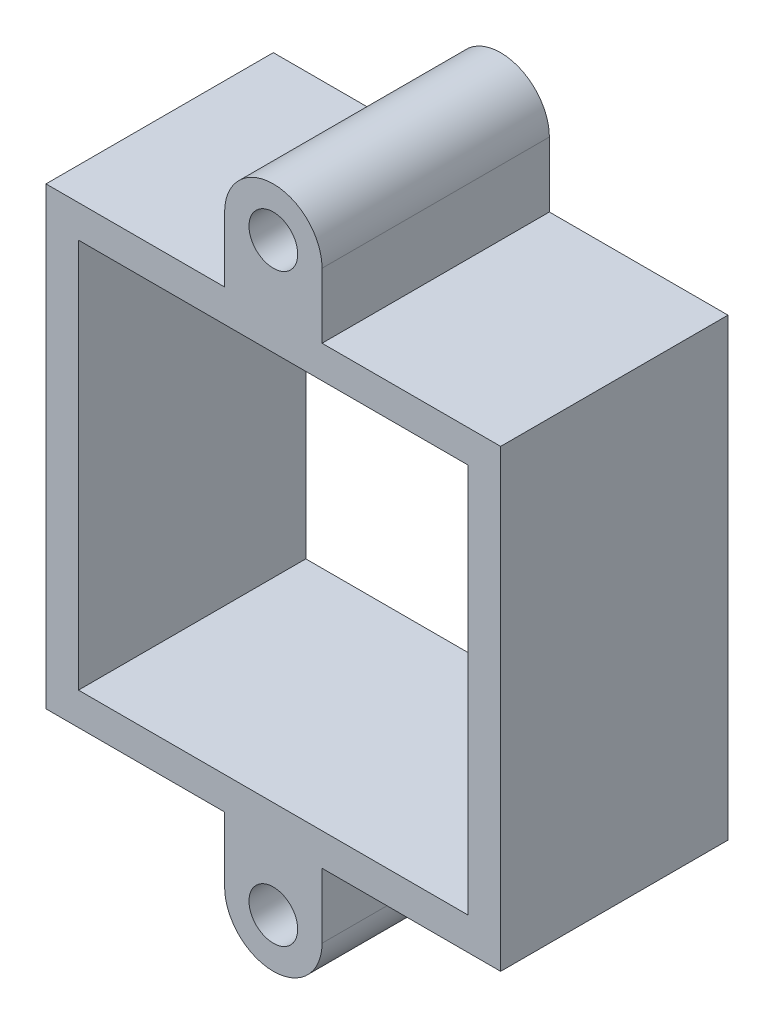
ISO-10303-21;
HEADER;
FILE_DESCRIPTION(('STEP AP214'),'2;1');
FILE_NAME('part.step','',(''),(''),'','','');
FILE_SCHEMA(('AUTOMOTIVE_DESIGN { 1 0 10303 214 1 1 1 1 }'));
ENDSEC;
DATA;
#1=APPLICATION_CONTEXT('core data for automotive mechanical design processes');
#2=APPLICATION_PROTOCOL_DEFINITION('international standard','automotive_design',2000,#1);
#3=PRODUCT_CONTEXT('',#1,'mechanical');
#4=PRODUCT('Part','Part','',(#3));
#5=PRODUCT_RELATED_PRODUCT_CATEGORY('part','',(#4));
#6=PRODUCT_DEFINITION_FORMATION('','',#4);
#7=PRODUCT_DEFINITION_CONTEXT('part definition',#1,'design');
#8=PRODUCT_DEFINITION('design','',#6,#7);
#9=PRODUCT_DEFINITION_SHAPE('','',#8);
#10=(LENGTH_UNIT() NAMED_UNIT(*) SI_UNIT(.MILLI.,.METRE.));
#11=(NAMED_UNIT(*) PLANE_ANGLE_UNIT() SI_UNIT($,.RADIAN.));
#12=(NAMED_UNIT(*) SI_UNIT($,.STERADIAN.) SOLID_ANGLE_UNIT());
#13=UNCERTAINTY_MEASURE_WITH_UNIT(LENGTH_MEASURE(1.E-05),#10,'distance_accuracy_value','');
#14=(GEOMETRIC_REPRESENTATION_CONTEXT(3) GLOBAL_UNCERTAINTY_ASSIGNED_CONTEXT((#13)) GLOBAL_UNIT_ASSIGNED_CONTEXT((#10,
#11,#12)) REPRESENTATION_CONTEXT('',''));
#15=CARTESIAN_POINT('',(0.,0.,0.));
#16=DIRECTION('',(0.,0.,1.));
#17=DIRECTION('',(1.,0.,0.));
#18=AXIS2_PLACEMENT_3D('',#15,#16,#17);
#19=CARTESIAN_POINT('',(-1.5,10.5,0.));
#20=DIRECTION('',(-1.,0.,0.));
#21=DIRECTION('',(0.,0.,1.));
#22=AXIS2_PLACEMENT_3D('',#19,#20,#21);
#23=PLANE('',#22);
#24=DIRECTION('',(0.,-1.,0.));
#25=VECTOR('',#24,1.);
#26=CARTESIAN_POINT('',(-1.5,10.5,7.));
#27=LINE('',#26,#25);
#28=CARTESIAN_POINT('',(-1.5,9.,7.));
#29=VERTEX_POINT('',#28);
#30=CARTESIAN_POINT('',(-1.5,7.,7.));
#31=VERTEX_POINT('',#30);
#32=EDGE_CURVE('E212',#29,#31,#27,.T.);
#33=ORIENTED_EDGE('',*,*,#32,.F.);
#34=DIRECTION('',(0.,0.,1.));
#35=VECTOR('',#34,1.);
#36=CARTESIAN_POINT('',(-1.5,9.,0.));
#37=LINE('',#36,#35);
#38=CARTESIAN_POINT('',(-1.5,9.,0.));
#39=VERTEX_POINT('',#38);
#40=EDGE_CURVE('E193',#39,#29,#37,.T.);
#41=ORIENTED_EDGE('',*,*,#40,.F.);
#42=DIRECTION('',(0.,-1.,0.));
#43=VECTOR('',#42,1.);
#44=CARTESIAN_POINT('',(-1.5,10.5,0.));
#45=LINE('',#44,#43);
#46=CARTESIAN_POINT('',(-1.5,7.,0.));
#47=VERTEX_POINT('',#46);
#48=EDGE_CURVE('E85',#39,#47,#45,.T.);
#49=ORIENTED_EDGE('',*,*,#48,.T.);
#50=DIRECTION('',(0.,0.,-1.));
#51=VECTOR('',#50,1.);
#52=CARTESIAN_POINT('',(-1.5,7.,0.));
#53=LINE('',#52,#51);
#54=EDGE_CURVE('E339',#31,#47,#53,.T.);
#55=ORIENTED_EDGE('',*,*,#54,.F.);
#56=EDGE_LOOP('',(#33,#41,#49,#55));
#57=FACE_BOUND('',#56,.T.);
#58=ADVANCED_FACE('F70',(#57),#23,.T.);
#59=CARTESIAN_POINT('',(-7.,7.,7.));
#60=DIRECTION('',(0.,-1.,0.));
#61=DIRECTION('',(1.,0.,0.));
#62=AXIS2_PLACEMENT_3D('',#59,#60,#61);
#63=PLANE('',#62);
#64=DIRECTION('',(-1.,0.,0.));
#65=VECTOR('',#64,1.);
#66=CARTESIAN_POINT('',(-7.,7.,0.));
#67=LINE('',#66,#65);
#68=CARTESIAN_POINT('',(7.,7.,0.));
#69=VERTEX_POINT('',#68);
#70=CARTESIAN_POINT('',(1.5,7.,0.));
#71=VERTEX_POINT('',#70);
#72=EDGE_CURVE('E277',#69,#71,#67,.T.);
#73=ORIENTED_EDGE('',*,*,#72,.T.);
#74=DIRECTION('',(0.,0.,1.));
#75=VECTOR('',#74,1.);
#76=CARTESIAN_POINT('',(1.5,7.,0.));
#77=LINE('',#76,#75);
#78=CARTESIAN_POINT('',(1.5,7.,7.));
#79=VERTEX_POINT('',#78);
#80=EDGE_CURVE('E205',#71,#79,#77,.T.);
#81=ORIENTED_EDGE('',*,*,#80,.T.);
#82=DIRECTION('',(-1.,0.,0.));
#83=VECTOR('',#82,1.);
#84=CARTESIAN_POINT('',(-7.,7.,7.));
#85=LINE('',#84,#83);
#86=CARTESIAN_POINT('',(7.,7.,7.));
#87=VERTEX_POINT('',#86);
#88=EDGE_CURVE('E284',#87,#79,#85,.T.);
#89=ORIENTED_EDGE('',*,*,#88,.F.);
#90=DIRECTION('',(0.,0.,-1.));
#91=VECTOR('',#90,1.);
#92=CARTESIAN_POINT('',(7.,7.,7.));
#93=LINE('',#92,#91);
#94=EDGE_CURVE('E300',#87,#69,#93,.T.);
#95=ORIENTED_EDGE('',*,*,#94,.T.);
#96=EDGE_LOOP('',(#73,#81,#89,#95));
#97=FACE_BOUND('',#96,.T.);
#98=ADVANCED_FACE('F313',(#97),#63,.F.);
#99=CARTESIAN_POINT('',(0.,0.,7.));
#100=DIRECTION('',(0.,0.,-1.));
#101=DIRECTION('',(-1.,0.,0.));
#102=AXIS2_PLACEMENT_3D('',#99,#100,#101);
#103=PLANE('',#102);
#104=CARTESIAN_POINT('',(0.,9.,7.));
#105=DIRECTION('',(0.,0.,-1.));
#106=DIRECTION('',(1.,0.,0.));
#107=AXIS2_PLACEMENT_3D('',#104,#105,#106);
#108=CIRCLE('',#107,0.750000000000001);
#109=CARTESIAN_POINT('',(0.750000000000001,9.,7.));
#110=VERTEX_POINT('',#109);
#111=EDGE_CURVE('E346',#110,#110,#108,.T.);
#112=ORIENTED_EDGE('',*,*,#111,.T.);
#113=EDGE_LOOP('',(#112));
#114=FACE_BOUND('',#113,.T.);
#115=CARTESIAN_POINT('',(0.,-9.,7.));
#116=DIRECTION('',(0.,0.,1.));
#117=DIRECTION('',(1.,0.,0.));
#118=AXIS2_PLACEMENT_3D('',#115,#116,#117);
#119=CIRCLE('',#118,0.750000000000001);
#120=CARTESIAN_POINT('',(0.750000000000001,-9.,7.));
#121=VERTEX_POINT('',#120);
#122=EDGE_CURVE('E222',#121,#121,#119,.T.);
#123=ORIENTED_EDGE('',*,*,#122,.F.);
#124=EDGE_LOOP('',(#123));
#125=FACE_BOUND('',#124,.T.);
#126=DIRECTION('',(0.,1.,0.));
#127=VECTOR('',#126,1.);
#128=CARTESIAN_POINT('',(6.,-6.,7.));
#129=LINE('',#128,#127);
#130=CARTESIAN_POINT('',(6.,-6.,7.));
#131=VERTEX_POINT('',#130);
#132=CARTESIAN_POINT('',(6.,6.,7.));
#133=VERTEX_POINT('',#132);
#134=EDGE_CURVE('E242',#131,#133,#129,.T.);
#135=ORIENTED_EDGE('',*,*,#134,.F.);
#136=DIRECTION('',(1.,0.,0.));
#137=VECTOR('',#136,1.);
#138=CARTESIAN_POINT('',(-6.,-6.,7.));
#139=LINE('',#138,#137);
#140=CARTESIAN_POINT('',(-6.,-6.,7.));
#141=VERTEX_POINT('',#140);
#142=EDGE_CURVE('E250',#141,#131,#139,.T.);
#143=ORIENTED_EDGE('',*,*,#142,.F.);
#144=DIRECTION('',(0.,-1.,0.));
#145=VECTOR('',#144,1.);
#146=CARTESIAN_POINT('',(-6.,-6.,7.));
#147=LINE('',#146,#145);
#148=CARTESIAN_POINT('',(-6.,6.,7.));
#149=VERTEX_POINT('',#148);
#150=EDGE_CURVE('E247',#149,#141,#147,.T.);
#151=ORIENTED_EDGE('',*,*,#150,.F.);
#152=DIRECTION('',(-1.,0.,0.));
#153=VECTOR('',#152,1.);
#154=CARTESIAN_POINT('',(-6.,6.,7.));
#155=LINE('',#154,#153);
#156=EDGE_CURVE('E244',#133,#149,#155,.T.);
#157=ORIENTED_EDGE('',*,*,#156,.F.);
#158=EDGE_LOOP('',(#135,#143,#151,#157));
#159=FACE_BOUND('',#158,.T.);
#160=DIRECTION('',(0.,-1.,0.));
#161=VECTOR('',#160,1.);
#162=CARTESIAN_POINT('',(1.5,10.5,7.));
#163=LINE('',#162,#161);
#164=CARTESIAN_POINT('',(1.5,9.,7.));
#165=VERTEX_POINT('',#164);
#166=EDGE_CURVE('E316',#165,#79,#163,.T.);
#167=ORIENTED_EDGE('',*,*,#166,.F.);
#168=CARTESIAN_POINT('',(0.,9.,7.));
#169=DIRECTION('',(0.,0.,-1.));
#170=DIRECTION('',(1.,0.,0.));
#171=AXIS2_PLACEMENT_3D('',#168,#169,#170);
#172=CIRCLE('',#171,1.5);
#173=EDGE_CURVE('E194',#29,#165,#172,.T.);
#174=ORIENTED_EDGE('',*,*,#173,.F.);
#175=ORIENTED_EDGE('',*,*,#32,.T.);
#176=CARTESIAN_POINT('',(-7.,7.,7.));
#177=VERTEX_POINT('',#176);
#178=EDGE_CURVE('E283',#31,#177,#85,.T.);
#179=ORIENTED_EDGE('',*,*,#178,.T.);
#180=DIRECTION('',(0.,-1.,0.));
#181=VECTOR('',#180,1.);
#182=CARTESIAN_POINT('',(-7.,-7.,7.));
#183=LINE('',#182,#181);
#184=CARTESIAN_POINT('',(-7.,-7.,7.));
#185=VERTEX_POINT('',#184);
#186=EDGE_CURVE('E273',#177,#185,#183,.T.);
#187=ORIENTED_EDGE('',*,*,#186,.T.);
#188=DIRECTION('',(1.,0.,0.));
#189=VECTOR('',#188,1.);
#190=CARTESIAN_POINT('',(-7.,-7.,7.));
#191=LINE('',#190,#189);
#192=CARTESIAN_POINT('',(-1.5,-7.,7.));
#193=VERTEX_POINT('',#192);
#194=EDGE_CURVE('E278',#185,#193,#191,.T.);
#195=ORIENTED_EDGE('',*,*,#194,.T.);
#196=DIRECTION('',(0.,1.,0.));
#197=VECTOR('',#196,1.);
#198=CARTESIAN_POINT('',(-1.5,-10.5,7.));
#199=LINE('',#198,#197);
#200=CARTESIAN_POINT('',(-1.5,-9.,7.));
#201=VERTEX_POINT('',#200);
#202=EDGE_CURVE('E238',#201,#193,#199,.T.);
#203=ORIENTED_EDGE('',*,*,#202,.F.);
#204=CARTESIAN_POINT('',(0.,-9.,7.));
#205=DIRECTION('',(0.,0.,1.));
#206=DIRECTION('',(1.,0.,0.));
#207=AXIS2_PLACEMENT_3D('',#204,#205,#206);
#208=CIRCLE('',#207,1.5);
#209=CARTESIAN_POINT('',(1.5,-9.,7.));
#210=VERTEX_POINT('',#209);
#211=EDGE_CURVE('E210',#201,#210,#208,.T.);
#212=ORIENTED_EDGE('',*,*,#211,.T.);
#213=DIRECTION('',(0.,1.,0.));
#214=VECTOR('',#213,1.);
#215=CARTESIAN_POINT('',(1.5,-10.5,7.));
#216=LINE('',#215,#214);
#217=CARTESIAN_POINT('',(1.5,-7.,7.));
#218=VERTEX_POINT('',#217);
#219=EDGE_CURVE('E93',#210,#218,#216,.T.);
#220=ORIENTED_EDGE('',*,*,#219,.T.);
#221=CARTESIAN_POINT('',(7.,-7.,7.));
#222=VERTEX_POINT('',#221);
#223=EDGE_CURVE('E276',#218,#222,#191,.T.);
#224=ORIENTED_EDGE('',*,*,#223,.T.);
#225=DIRECTION('',(0.,1.,0.));
#226=VECTOR('',#225,1.);
#227=CARTESIAN_POINT('',(7.,-7.,7.));
#228=LINE('',#227,#226);
#229=EDGE_CURVE('E281',#222,#87,#228,.T.);
#230=ORIENTED_EDGE('',*,*,#229,.T.);
#231=ORIENTED_EDGE('',*,*,#88,.T.);
#232=EDGE_LOOP('',(#167,#174,#175,#179,#187,#195,#203,#212,#220,#224,#230,#231));
#233=FACE_BOUND('',#232,.T.);
#234=ADVANCED_FACE('F315',(#114,#125,#159,#233),#103,.F.);
#235=CARTESIAN_POINT('',(0.,0.,0.));
#236=DIRECTION('',(0.,0.,-1.));
#237=DIRECTION('',(-1.,0.,0.));
#238=AXIS2_PLACEMENT_3D('',#235,#236,#237);
#239=PLANE('',#238);
#240=CARTESIAN_POINT('',(0.,9.,0.));
#241=DIRECTION('',(0.,0.,-1.));
#242=DIRECTION('',(1.,0.,0.));
#243=AXIS2_PLACEMENT_3D('',#240,#241,#242);
#244=CIRCLE('',#243,1.5);
#245=CARTESIAN_POINT('',(1.5,9.,0.));
#246=VERTEX_POINT('',#245);
#247=EDGE_CURVE('E183',#39,#246,#244,.T.);
#248=ORIENTED_EDGE('',*,*,#247,.T.);
#249=DIRECTION('',(0.,-1.,0.));
#250=VECTOR('',#249,1.);
#251=CARTESIAN_POINT('',(1.5,10.5,0.));
#252=LINE('',#251,#250);
#253=EDGE_CURVE('E189',#246,#71,#252,.T.);
#254=ORIENTED_EDGE('',*,*,#253,.T.);
#255=ORIENTED_EDGE('',*,*,#72,.F.);
#256=DIRECTION('',(0.,1.,0.));
#257=VECTOR('',#256,1.);
#258=CARTESIAN_POINT('',(7.,-7.,0.));
#259=LINE('',#258,#257);
#260=CARTESIAN_POINT('',(7.,-7.,0.));
#261=VERTEX_POINT('',#260);
#262=EDGE_CURVE('E294',#261,#69,#259,.T.);
#263=ORIENTED_EDGE('',*,*,#262,.F.);
#264=DIRECTION('',(1.,0.,0.));
#265=VECTOR('',#264,1.);
#266=CARTESIAN_POINT('',(-7.,-7.,0.));
#267=LINE('',#266,#265);
#268=CARTESIAN_POINT('',(1.5,-7.,0.));
#269=VERTEX_POINT('',#268);
#270=EDGE_CURVE('E290',#269,#261,#267,.T.);
#271=ORIENTED_EDGE('',*,*,#270,.F.);
#272=DIRECTION('',(0.,1.,0.));
#273=VECTOR('',#272,1.);
#274=CARTESIAN_POINT('',(1.5,-10.5,0.));
#275=LINE('',#274,#273);
#276=CARTESIAN_POINT('',(1.5,-9.,0.));
#277=VERTEX_POINT('',#276);
#278=EDGE_CURVE('E234',#277,#269,#275,.T.);
#279=ORIENTED_EDGE('',*,*,#278,.F.);
#280=CARTESIAN_POINT('',(0.,-9.,0.));
#281=DIRECTION('',(0.,0.,1.));
#282=DIRECTION('',(1.,0.,0.));
#283=AXIS2_PLACEMENT_3D('',#280,#281,#282);
#284=CIRCLE('',#283,1.5);
#285=CARTESIAN_POINT('',(-1.5,-9.,0.));
#286=VERTEX_POINT('',#285);
#287=EDGE_CURVE('E216',#286,#277,#284,.T.);
#288=ORIENTED_EDGE('',*,*,#287,.F.);
#289=DIRECTION('',(0.,1.,0.));
#290=VECTOR('',#289,1.);
#291=CARTESIAN_POINT('',(-1.5,-10.5,0.));
#292=LINE('',#291,#290);
#293=CARTESIAN_POINT('',(-1.5,-7.,0.));
#294=VERTEX_POINT('',#293);
#295=EDGE_CURVE('E236',#286,#294,#292,.T.);
#296=ORIENTED_EDGE('',*,*,#295,.T.);
#297=CARTESIAN_POINT('',(-7.,-7.,0.));
#298=VERTEX_POINT('',#297);
#299=EDGE_CURVE('E291',#298,#294,#267,.T.);
#300=ORIENTED_EDGE('',*,*,#299,.F.);
#301=DIRECTION('',(0.,-1.,0.));
#302=VECTOR('',#301,1.);
#303=CARTESIAN_POINT('',(-7.,-7.,0.));
#304=LINE('',#303,#302);
#305=CARTESIAN_POINT('',(-7.,7.,0.));
#306=VERTEX_POINT('',#305);
#307=EDGE_CURVE('E272',#306,#298,#304,.T.);
#308=ORIENTED_EDGE('',*,*,#307,.F.);
#309=EDGE_CURVE('E296',#47,#306,#67,.T.);
#310=ORIENTED_EDGE('',*,*,#309,.F.);
#311=ORIENTED_EDGE('',*,*,#48,.F.);
#312=EDGE_LOOP('',(#248,#254,#255,#263,#271,#279,#288,#296,#300,#308,#310,#311));
#313=FACE_BOUND('',#312,.T.);
#314=CARTESIAN_POINT('',(0.,9.,0.));
#315=DIRECTION('',(0.,0.,-1.));
#316=DIRECTION('',(1.,0.,0.));
#317=AXIS2_PLACEMENT_3D('',#314,#315,#316);
#318=CIRCLE('',#317,0.750000000000001);
#319=CARTESIAN_POINT('',(0.750000000000001,9.,0.));
#320=VERTEX_POINT('',#319);
#321=EDGE_CURVE('E343',#320,#320,#318,.T.);
#322=ORIENTED_EDGE('',*,*,#321,.F.);
#323=EDGE_LOOP('',(#322));
#324=FACE_BOUND('',#323,.T.);
#325=CARTESIAN_POINT('',(0.,-9.,0.));
#326=DIRECTION('',(0.,0.,1.));
#327=DIRECTION('',(1.,0.,0.));
#328=AXIS2_PLACEMENT_3D('',#325,#326,#327);
#329=CIRCLE('',#328,0.750000000000001);
#330=CARTESIAN_POINT('',(0.750000000000001,-9.,0.));
#331=VERTEX_POINT('',#330);
#332=EDGE_CURVE('E223',#331,#331,#329,.T.);
#333=ORIENTED_EDGE('',*,*,#332,.T.);
#334=EDGE_LOOP('',(#333));
#335=FACE_BOUND('',#334,.T.);
#336=DIRECTION('',(1.,0.,0.));
#337=VECTOR('',#336,1.);
#338=CARTESIAN_POINT('',(-6.,-6.,0.));
#339=LINE('',#338,#337);
#340=CARTESIAN_POINT('',(-6.,-6.,0.));
#341=VERTEX_POINT('',#340);
#342=CARTESIAN_POINT('',(6.,-6.,0.));
#343=VERTEX_POINT('',#342);
#344=EDGE_CURVE('E245',#341,#343,#339,.T.);
#345=ORIENTED_EDGE('',*,*,#344,.T.);
#346=DIRECTION('',(0.,1.,0.));
#347=VECTOR('',#346,1.);
#348=CARTESIAN_POINT('',(6.,-6.,0.));
#349=LINE('',#348,#347);
#350=CARTESIAN_POINT('',(6.,6.,0.));
#351=VERTEX_POINT('',#350);
#352=EDGE_CURVE('E241',#343,#351,#349,.T.);
#353=ORIENTED_EDGE('',*,*,#352,.T.);
#354=DIRECTION('',(-1.,0.,0.));
#355=VECTOR('',#354,1.);
#356=CARTESIAN_POINT('',(-6.,6.,0.));
#357=LINE('',#356,#355);
#358=CARTESIAN_POINT('',(-6.,6.,0.));
#359=VERTEX_POINT('',#358);
#360=EDGE_CURVE('E255',#351,#359,#357,.T.);
#361=ORIENTED_EDGE('',*,*,#360,.T.);
#362=DIRECTION('',(0.,-1.,0.));
#363=VECTOR('',#362,1.);
#364=CARTESIAN_POINT('',(-6.,-6.,0.));
#365=LINE('',#364,#363);
#366=EDGE_CURVE('E258',#359,#341,#365,.T.);
#367=ORIENTED_EDGE('',*,*,#366,.T.);
#368=EDGE_LOOP('',(#345,#353,#361,#367));
#369=FACE_BOUND('',#368,.T.);
#370=ADVANCED_FACE('F185',(#313,#324,#335,#369),#239,.T.);
#371=CARTESIAN_POINT('',(1.5,-10.5,0.));
#372=DIRECTION('',(-1.,0.,0.));
#373=DIRECTION('',(0.,0.,1.));
#374=AXIS2_PLACEMENT_3D('',#371,#372,#373);
#375=PLANE('',#374);
#376=DIRECTION('',(0.,0.,1.));
#377=VECTOR('',#376,1.);
#378=CARTESIAN_POINT('',(1.5,-9.,0.));
#379=LINE('',#378,#377);
#380=EDGE_CURVE('E207',#277,#210,#379,.T.);
#381=ORIENTED_EDGE('',*,*,#380,.F.);
#382=ORIENTED_EDGE('',*,*,#278,.T.);
#383=DIRECTION('',(0.,0.,1.));
#384=VECTOR('',#383,1.);
#385=CARTESIAN_POINT('',(1.5,-7.,0.));
#386=LINE('',#385,#384);
#387=EDGE_CURVE('E226',#269,#218,#386,.T.);
#388=ORIENTED_EDGE('',*,*,#387,.T.);
#389=ORIENTED_EDGE('',*,*,#219,.F.);
#390=EDGE_LOOP('',(#381,#382,#388,#389));
#391=FACE_BOUND('',#390,.T.);
#392=ADVANCED_FACE('F321',(#391),#375,.F.);
#393=CARTESIAN_POINT('',(-7.,-7.,7.));
#394=DIRECTION('',(0.,1.,0.));
#395=DIRECTION('',(0.,0.,1.));
#396=AXIS2_PLACEMENT_3D('',#393,#394,#395);
#397=PLANE('',#396);
#398=ORIENTED_EDGE('',*,*,#387,.F.);
#399=ORIENTED_EDGE('',*,*,#270,.T.);
#400=DIRECTION('',(0.,0.,-1.));
#401=VECTOR('',#400,1.);
#402=CARTESIAN_POINT('',(7.,-7.,7.));
#403=LINE('',#402,#401);
#404=EDGE_CURVE('E78',#222,#261,#403,.T.);
#405=ORIENTED_EDGE('',*,*,#404,.F.);
#406=ORIENTED_EDGE('',*,*,#223,.F.);
#407=EDGE_LOOP('',(#398,#399,#405,#406));
#408=FACE_BOUND('',#407,.T.);
#409=ADVANCED_FACE('F318',(#408),#397,.F.);
#410=DIRECTION('',(0.,0.,-1.));
#411=VECTOR('',#410,1.);
#412=CARTESIAN_POINT('',(-1.5,-7.,0.));
#413=LINE('',#412,#411);
#414=EDGE_CURVE('E231',#193,#294,#413,.T.);
#415=ORIENTED_EDGE('',*,*,#414,.F.);
#416=ORIENTED_EDGE('',*,*,#194,.F.);
#417=DIRECTION('',(0.,0.,-1.));
#418=VECTOR('',#417,1.);
#419=CARTESIAN_POINT('',(-7.,-7.,7.));
#420=LINE('',#419,#418);
#421=EDGE_CURVE('E12',#185,#298,#420,.T.);
#422=ORIENTED_EDGE('',*,*,#421,.T.);
#423=ORIENTED_EDGE('',*,*,#299,.T.);
#424=EDGE_LOOP('',(#415,#416,#422,#423));
#425=FACE_BOUND('',#424,.T.);
#426=ADVANCED_FACE('F330',(#425),#397,.F.);
#427=CARTESIAN_POINT('',(-7.,-7.,7.));
#428=DIRECTION('',(1.,0.,0.));
#429=DIRECTION('',(0.,0.,-1.));
#430=AXIS2_PLACEMENT_3D('',#427,#428,#429);
#431=PLANE('',#430);
#432=ORIENTED_EDGE('',*,*,#307,.T.);
#433=ORIENTED_EDGE('',*,*,#421,.F.);
#434=ORIENTED_EDGE('',*,*,#186,.F.);
#435=DIRECTION('',(0.,0.,-1.));
#436=VECTOR('',#435,1.);
#437=CARTESIAN_POINT('',(-7.,7.,7.));
#438=LINE('',#437,#436);
#439=EDGE_CURVE('E287',#177,#306,#438,.T.);
#440=ORIENTED_EDGE('',*,*,#439,.T.);
#441=EDGE_LOOP('',(#432,#433,#434,#440));
#442=FACE_BOUND('',#441,.T.);
#443=ADVANCED_FACE('F72',(#442),#431,.F.);
#444=CARTESIAN_POINT('',(7.,-7.,7.));
#445=DIRECTION('',(-1.,0.,0.));
#446=DIRECTION('',(0.,-1.,0.));
#447=AXIS2_PLACEMENT_3D('',#444,#445,#446);
#448=PLANE('',#447);
#449=ORIENTED_EDGE('',*,*,#262,.T.);
#450=ORIENTED_EDGE('',*,*,#94,.F.);
#451=ORIENTED_EDGE('',*,*,#229,.F.);
#452=ORIENTED_EDGE('',*,*,#404,.T.);
#453=EDGE_LOOP('',(#449,#450,#451,#452));
#454=FACE_BOUND('',#453,.T.);
#455=ADVANCED_FACE('F307',(#454),#448,.F.);
#456=ORIENTED_EDGE('',*,*,#178,.F.);
#457=ORIENTED_EDGE('',*,*,#54,.T.);
#458=ORIENTED_EDGE('',*,*,#309,.T.);
#459=ORIENTED_EDGE('',*,*,#439,.F.);
#460=EDGE_LOOP('',(#456,#457,#458,#459));
#461=FACE_BOUND('',#460,.T.);
#462=ADVANCED_FACE('F338',(#461),#63,.F.);
#463=CARTESIAN_POINT('',(6.,-6.,7.));
#464=DIRECTION('',(-1.,0.,0.));
#465=DIRECTION('',(0.,0.,1.));
#466=AXIS2_PLACEMENT_3D('',#463,#464,#465);
#467=PLANE('',#466);
#468=ORIENTED_EDGE('',*,*,#352,.F.);
#469=DIRECTION('',(0.,0.,-1.));
#470=VECTOR('',#469,1.);
#471=CARTESIAN_POINT('',(6.,-6.,7.));
#472=LINE('',#471,#470);
#473=EDGE_CURVE('E252',#131,#343,#472,.T.);
#474=ORIENTED_EDGE('',*,*,#473,.F.);
#475=ORIENTED_EDGE('',*,*,#134,.T.);
#476=DIRECTION('',(0.,0.,-1.));
#477=VECTOR('',#476,1.);
#478=CARTESIAN_POINT('',(6.,6.,7.));
#479=LINE('',#478,#477);
#480=EDGE_CURVE('E269',#133,#351,#479,.T.);
#481=ORIENTED_EDGE('',*,*,#480,.T.);
#482=EDGE_LOOP('',(#468,#474,#475,#481));
#483=FACE_BOUND('',#482,.T.);
#484=ADVANCED_FACE('F369',(#483),#467,.T.);
#485=CARTESIAN_POINT('',(-6.,6.,7.));
#486=DIRECTION('',(0.,-1.,0.));
#487=DIRECTION('',(0.,0.,-1.));
#488=AXIS2_PLACEMENT_3D('',#485,#486,#487);
#489=PLANE('',#488);
#490=ORIENTED_EDGE('',*,*,#360,.F.);
#491=ORIENTED_EDGE('',*,*,#480,.F.);
#492=ORIENTED_EDGE('',*,*,#156,.T.);
#493=DIRECTION('',(0.,0.,-1.));
#494=VECTOR('',#493,1.);
#495=CARTESIAN_POINT('',(-6.,6.,7.));
#496=LINE('',#495,#494);
#497=EDGE_CURVE('E267',#149,#359,#496,.T.);
#498=ORIENTED_EDGE('',*,*,#497,.T.);
#499=EDGE_LOOP('',(#490,#491,#492,#498));
#500=FACE_BOUND('',#499,.T.);
#501=ADVANCED_FACE('F376',(#500),#489,.T.);
#502=CARTESIAN_POINT('',(-6.,-6.,7.));
#503=DIRECTION('',(1.,0.,0.));
#504=DIRECTION('',(0.,0.,-1.));
#505=AXIS2_PLACEMENT_3D('',#502,#503,#504);
#506=PLANE('',#505);
#507=ORIENTED_EDGE('',*,*,#366,.F.);
#508=ORIENTED_EDGE('',*,*,#497,.F.);
#509=ORIENTED_EDGE('',*,*,#150,.T.);
#510=DIRECTION('',(0.,0.,-1.));
#511=VECTOR('',#510,1.);
#512=CARTESIAN_POINT('',(-6.,-6.,7.));
#513=LINE('',#512,#511);
#514=EDGE_CURVE('E265',#141,#341,#513,.T.);
#515=ORIENTED_EDGE('',*,*,#514,.T.);
#516=EDGE_LOOP('',(#507,#508,#509,#515));
#517=FACE_BOUND('',#516,.T.);
#518=ADVANCED_FACE('F378',(#517),#506,.T.);
#519=CARTESIAN_POINT('',(-6.,-6.,7.));
#520=DIRECTION('',(0.,1.,0.));
#521=DIRECTION('',(0.,0.,1.));
#522=AXIS2_PLACEMENT_3D('',#519,#520,#521);
#523=PLANE('',#522);
#524=ORIENTED_EDGE('',*,*,#344,.F.);
#525=ORIENTED_EDGE('',*,*,#514,.F.);
#526=ORIENTED_EDGE('',*,*,#142,.T.);
#527=ORIENTED_EDGE('',*,*,#473,.T.);
#528=EDGE_LOOP('',(#524,#525,#526,#527));
#529=FACE_BOUND('',#528,.T.);
#530=ADVANCED_FACE('F364',(#529),#523,.T.);
#531=CARTESIAN_POINT('',(-1.5,-10.5,0.));
#532=DIRECTION('',(1.,0.,0.));
#533=DIRECTION('',(0.,0.,-1.));
#534=AXIS2_PLACEMENT_3D('',#531,#532,#533);
#535=PLANE('',#534);
#536=ORIENTED_EDGE('',*,*,#295,.F.);
#537=DIRECTION('',(0.,0.,1.));
#538=VECTOR('',#537,1.);
#539=CARTESIAN_POINT('',(-1.5,-9.,0.));
#540=LINE('',#539,#538);
#541=EDGE_CURVE('E218',#286,#201,#540,.T.);
#542=ORIENTED_EDGE('',*,*,#541,.T.);
#543=ORIENTED_EDGE('',*,*,#202,.T.);
#544=ORIENTED_EDGE('',*,*,#414,.T.);
#545=EDGE_LOOP('',(#536,#542,#543,#544));
#546=FACE_BOUND('',#545,.T.);
#547=ADVANCED_FACE('F326',(#546),#535,.F.);
#548=CARTESIAN_POINT('',(0.,-9.,0.));
#549=DIRECTION('',(0.,0.,1.));
#550=DIRECTION('',(1.,0.,0.));
#551=AXIS2_PLACEMENT_3D('',#548,#549,#550);
#552=CYLINDRICAL_SURFACE('',#551,0.750000000000001);
#553=ORIENTED_EDGE('',*,*,#332,.F.);
#554=EDGE_LOOP('',(#553));
#555=FACE_BOUND('',#554,.T.);
#556=ORIENTED_EDGE('',*,*,#122,.T.);
#557=EDGE_LOOP('',(#556));
#558=FACE_BOUND('',#557,.T.);
#559=ADVANCED_FACE('F401',(#555,#558),#552,.F.);
#560=CARTESIAN_POINT('',(0.,-9.,0.));
#561=DIRECTION('',(0.,0.,1.));
#562=DIRECTION('',(1.,0.,0.));
#563=AXIS2_PLACEMENT_3D('',#560,#561,#562);
#564=CYLINDRICAL_SURFACE('',#563,1.5);
#565=ORIENTED_EDGE('',*,*,#211,.F.);
#566=ORIENTED_EDGE('',*,*,#541,.F.);
#567=ORIENTED_EDGE('',*,*,#287,.T.);
#568=ORIENTED_EDGE('',*,*,#380,.T.);
#569=EDGE_LOOP('',(#565,#566,#567,#568));
#570=FACE_BOUND('',#569,.T.);
#571=ADVANCED_FACE('F398',(#570),#564,.T.);
#572=CARTESIAN_POINT('',(1.5,10.5,0.));
#573=DIRECTION('',(1.,0.,0.));
#574=DIRECTION('',(0.,0.,-1.));
#575=AXIS2_PLACEMENT_3D('',#572,#573,#574);
#576=PLANE('',#575);
#577=DIRECTION('',(0.,0.,1.));
#578=VECTOR('',#577,1.);
#579=CARTESIAN_POINT('',(1.5,9.,0.));
#580=LINE('',#579,#578);
#581=EDGE_CURVE('E197',#246,#165,#580,.T.);
#582=ORIENTED_EDGE('',*,*,#581,.T.);
#583=ORIENTED_EDGE('',*,*,#166,.T.);
#584=ORIENTED_EDGE('',*,*,#80,.F.);
#585=ORIENTED_EDGE('',*,*,#253,.F.);
#586=EDGE_LOOP('',(#582,#583,#584,#585));
#587=FACE_BOUND('',#586,.T.);
#588=ADVANCED_FACE('F203',(#587),#576,.T.);
#589=CARTESIAN_POINT('',(0.,9.,0.));
#590=DIRECTION('',(0.,0.,1.));
#591=DIRECTION('',(1.,0.,0.));
#592=AXIS2_PLACEMENT_3D('',#589,#590,#591);
#593=CYLINDRICAL_SURFACE('',#592,0.750000000000001);
#594=ORIENTED_EDGE('',*,*,#321,.T.);
#595=EDGE_LOOP('',(#594));
#596=FACE_BOUND('',#595,.T.);
#597=ORIENTED_EDGE('',*,*,#111,.F.);
#598=EDGE_LOOP('',(#597));
#599=FACE_BOUND('',#598,.T.);
#600=ADVANCED_FACE('F354',(#596,#599),#593,.F.);
#601=CARTESIAN_POINT('',(0.,9.,0.));
#602=DIRECTION('',(0.,0.,1.));
#603=DIRECTION('',(1.,0.,0.));
#604=AXIS2_PLACEMENT_3D('',#601,#602,#603);
#605=CYLINDRICAL_SURFACE('',#604,1.5);
#606=ORIENTED_EDGE('',*,*,#173,.T.);
#607=ORIENTED_EDGE('',*,*,#581,.F.);
#608=ORIENTED_EDGE('',*,*,#247,.F.);
#609=ORIENTED_EDGE('',*,*,#40,.T.);
#610=EDGE_LOOP('',(#606,#607,#608,#609));
#611=FACE_BOUND('',#610,.T.);
#612=ADVANCED_FACE('F198',(#611),#605,.T.);
#613=CLOSED_SHELL('',(#58,#98,#234,#370,#392,#409,#426,#443,#455,#462,#484,#501,#518,#530,#547,
#559,#571,#588,#600,#612));
#614=MANIFOLD_SOLID_BREP('B2',#613);
#615=ADVANCED_BREP_SHAPE_REPRESENTATION('',(#18,#614),#14);
#616=SHAPE_DEFINITION_REPRESENTATION(#9,#615);
ENDSEC;
END-ISO-10303-21;
